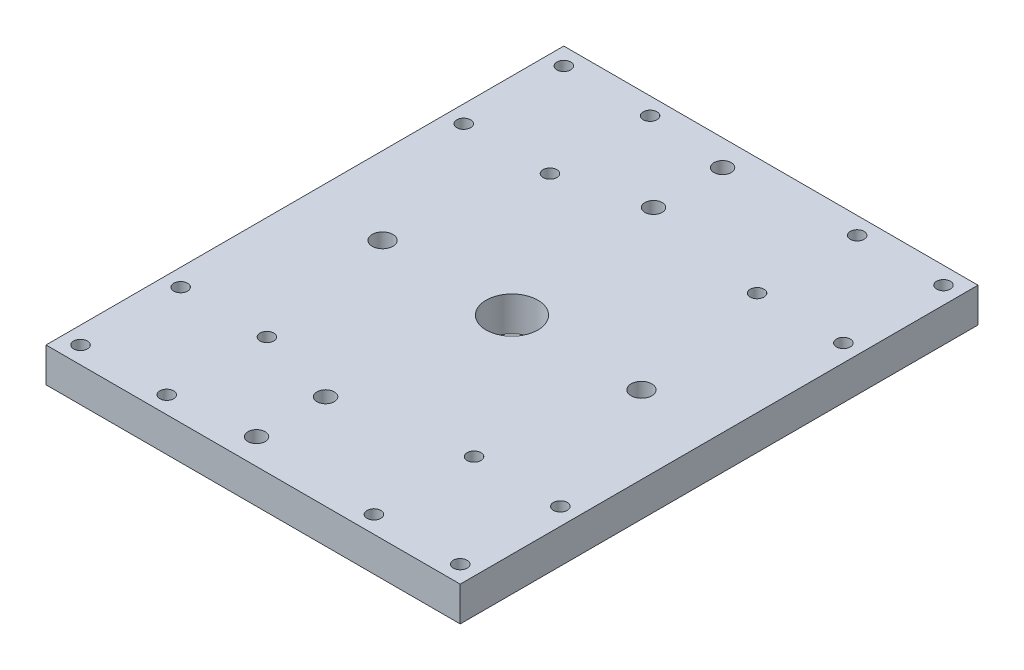
ISO-10303-21;
HEADER;
FILE_DESCRIPTION(('STEP AP214'),'2;1');
FILE_NAME('part.step','',(''),(''),'','','');
FILE_SCHEMA(('AUTOMOTIVE_DESIGN { 1 0 10303 214 1 1 1 1 }'));
ENDSEC;
DATA;
#1=APPLICATION_CONTEXT('core data for automotive mechanical design processes');
#2=APPLICATION_PROTOCOL_DEFINITION('international standard','automotive_design',2000,#1);
#3=PRODUCT_CONTEXT('',#1,'mechanical');
#4=PRODUCT('Part','Part','',(#3));
#5=PRODUCT_RELATED_PRODUCT_CATEGORY('part','',(#4));
#6=PRODUCT_DEFINITION_FORMATION('','',#4);
#7=PRODUCT_DEFINITION_CONTEXT('part definition',#1,'design');
#8=PRODUCT_DEFINITION('design','',#6,#7);
#9=PRODUCT_DEFINITION_SHAPE('','',#8);
#10=(LENGTH_UNIT() NAMED_UNIT(*) SI_UNIT(.MILLI.,.METRE.));
#11=(NAMED_UNIT(*) PLANE_ANGLE_UNIT() SI_UNIT($,.RADIAN.));
#12=(NAMED_UNIT(*) SI_UNIT($,.STERADIAN.) SOLID_ANGLE_UNIT());
#13=UNCERTAINTY_MEASURE_WITH_UNIT(LENGTH_MEASURE(1.E-05),#10,'distance_accuracy_value','');
#14=(GEOMETRIC_REPRESENTATION_CONTEXT(3) GLOBAL_UNCERTAINTY_ASSIGNED_CONTEXT((#13)) GLOBAL_UNIT_ASSIGNED_CONTEXT((#10,
#11,#12)) REPRESENTATION_CONTEXT('',''));
#15=CARTESIAN_POINT('',(0.,0.,0.));
#16=DIRECTION('',(0.,0.,1.));
#17=DIRECTION('',(1.,0.,0.));
#18=AXIS2_PLACEMENT_3D('',#15,#16,#17);
#19=CARTESIAN_POINT('',(0.,0.,0.));
#20=DIRECTION('',(0.,-1.,0.));
#21=DIRECTION('',(0.,0.,-1.));
#22=AXIS2_PLACEMENT_3D('',#19,#20,#21);
#23=PLANE('',#22);
#24=CARTESIAN_POINT('',(-75.,0.,0.));
#25=DIRECTION('',(0.,1.,0.));
#26=DIRECTION('',(0.,0.,1.));
#27=AXIS2_PLACEMENT_3D('',#24,#25,#26);
#28=CIRCLE('',#27,6.);
#29=CARTESIAN_POINT('',(-75.,0.,6.));
#30=VERTEX_POINT('',#29);
#31=EDGE_CURVE('E168',#30,#30,#28,.T.);
#32=ORIENTED_EDGE('',*,*,#31,.T.);
#33=EDGE_LOOP('',(#32));
#34=FACE_BOUND('',#33,.T.);
#35=CARTESIAN_POINT('',(-13.,0.,95.));
#36=DIRECTION('',(0.,1.,0.));
#37=DIRECTION('',(0.,0.,1.));
#38=AXIS2_PLACEMENT_3D('',#35,#36,#37);
#39=CIRCLE('',#38,5.);
#40=CARTESIAN_POINT('',(-13.,0.,100.));
#41=VERTEX_POINT('',#40);
#42=EDGE_CURVE('E182',#41,#41,#39,.T.);
#43=ORIENTED_EDGE('',*,*,#42,.T.);
#44=EDGE_LOOP('',(#43));
#45=FACE_BOUND('',#44,.T.);
#46=CARTESIAN_POINT('',(-13.,0.,-135.));
#47=DIRECTION('',(0.,1.,0.));
#48=DIRECTION('',(0.,0.,1.));
#49=AXIS2_PLACEMENT_3D('',#46,#47,#48);
#50=CIRCLE('',#49,5.);
#51=CARTESIAN_POINT('',(-13.,0.,-130.));
#52=VERTEX_POINT('',#51);
#53=EDGE_CURVE('E192',#52,#52,#50,.T.);
#54=ORIENTED_EDGE('',*,*,#53,.T.);
#55=EDGE_LOOP('',(#54));
#56=FACE_BOUND('',#55,.T.);
#57=CARTESIAN_POINT('',(-13.,0.,-95.));
#58=DIRECTION('',(0.,1.,0.));
#59=DIRECTION('',(0.,0.,1.));
#60=AXIS2_PLACEMENT_3D('',#57,#58,#59);
#61=CIRCLE('',#60,5.);
#62=CARTESIAN_POINT('',(-13.,0.,-90.));
#63=VERTEX_POINT('',#62);
#64=EDGE_CURVE('E198',#63,#63,#61,.T.);
#65=ORIENTED_EDGE('',*,*,#64,.T.);
#66=EDGE_LOOP('',(#65));
#67=FACE_BOUND('',#66,.T.);
#68=CARTESIAN_POINT('',(60.,0.,-82.));
#69=DIRECTION('',(0.,-1.,0.));
#70=DIRECTION('',(0.,0.,-1.));
#71=AXIS2_PLACEMENT_3D('',#68,#69,#70);
#72=CIRCLE('',#71,4.);
#73=CARTESIAN_POINT('',(60.,0.,-86.));
#74=VERTEX_POINT('',#73);
#75=EDGE_CURVE('E204',#74,#74,#72,.T.);
#76=ORIENTED_EDGE('',*,*,#75,.F.);
#77=EDGE_LOOP('',(#76));
#78=FACE_BOUND('',#77,.T.);
#79=CARTESIAN_POINT('',(110.,0.,-82.));
#80=DIRECTION('',(0.,-1.,0.));
#81=DIRECTION('',(0.,0.,-1.));
#82=AXIS2_PLACEMENT_3D('',#79,#80,#81);
#83=CIRCLE('',#82,4.);
#84=CARTESIAN_POINT('',(110.,0.,-86.));
#85=VERTEX_POINT('',#84);
#86=EDGE_CURVE('E210',#85,#85,#83,.T.);
#87=ORIENTED_EDGE('',*,*,#86,.F.);
#88=EDGE_LOOP('',(#87));
#89=FACE_BOUND('',#88,.T.);
#90=CARTESIAN_POINT('',(110.,0.,-140.));
#91=DIRECTION('',(0.,-1.,0.));
#92=DIRECTION('',(0.,0.,-1.));
#93=AXIS2_PLACEMENT_3D('',#90,#91,#92);
#94=CIRCLE('',#93,4.);
#95=CARTESIAN_POINT('',(110.,0.,-144.));
#96=VERTEX_POINT('',#95);
#97=EDGE_CURVE('E216',#96,#96,#94,.T.);
#98=ORIENTED_EDGE('',*,*,#97,.F.);
#99=EDGE_LOOP('',(#98));
#100=FACE_BOUND('',#99,.T.);
#101=CARTESIAN_POINT('',(60.,0.,-140.));
#102=DIRECTION('',(0.,-1.,0.));
#103=DIRECTION('',(0.,0.,-1.));
#104=AXIS2_PLACEMENT_3D('',#101,#102,#103);
#105=CIRCLE('',#104,4.);
#106=CARTESIAN_POINT('',(60.,0.,-144.));
#107=VERTEX_POINT('',#106);
#108=EDGE_CURVE('E222',#107,#107,#105,.T.);
#109=ORIENTED_EDGE('',*,*,#108,.F.);
#110=EDGE_LOOP('',(#109));
#111=FACE_BOUND('',#110,.T.);
#112=CARTESIAN_POINT('',(-110.,0.,-140.));
#113=DIRECTION('',(0.,-1.,0.));
#114=DIRECTION('',(0.,0.,-1.));
#115=AXIS2_PLACEMENT_3D('',#112,#113,#114);
#116=CIRCLE('',#115,4.);
#117=CARTESIAN_POINT('',(-110.,0.,-144.));
#118=VERTEX_POINT('',#117);
#119=EDGE_CURVE('E225',#118,#118,#116,.T.);
#120=ORIENTED_EDGE('',*,*,#119,.F.);
#121=EDGE_LOOP('',(#120));
#122=FACE_BOUND('',#121,.T.);
#123=CARTESIAN_POINT('',(-110.,0.,-82.));
#124=DIRECTION('',(0.,-1.,0.));
#125=DIRECTION('',(0.,0.,-1.));
#126=AXIS2_PLACEMENT_3D('',#123,#124,#125);
#127=CIRCLE('',#126,4.);
#128=CARTESIAN_POINT('',(-110.,0.,-86.));
#129=VERTEX_POINT('',#128);
#130=EDGE_CURVE('E231',#129,#129,#127,.T.);
#131=ORIENTED_EDGE('',*,*,#130,.F.);
#132=EDGE_LOOP('',(#131));
#133=FACE_BOUND('',#132,.T.);
#134=CARTESIAN_POINT('',(-60.,0.,-82.));
#135=DIRECTION('',(0.,-1.,0.));
#136=DIRECTION('',(0.,0.,-1.));
#137=AXIS2_PLACEMENT_3D('',#134,#135,#136);
#138=CIRCLE('',#137,4.);
#139=CARTESIAN_POINT('',(-60.,0.,-86.));
#140=VERTEX_POINT('',#139);
#141=EDGE_CURVE('E237',#140,#140,#138,.T.);
#142=ORIENTED_EDGE('',*,*,#141,.F.);
#143=EDGE_LOOP('',(#142));
#144=FACE_BOUND('',#143,.T.);
#145=CARTESIAN_POINT('',(-60.,0.,-140.));
#146=DIRECTION('',(0.,-1.,0.));
#147=DIRECTION('',(0.,0.,-1.));
#148=AXIS2_PLACEMENT_3D('',#145,#146,#147);
#149=CIRCLE('',#148,4.);
#150=CARTESIAN_POINT('',(-60.,0.,-144.));
#151=VERTEX_POINT('',#150);
#152=EDGE_CURVE('E243',#151,#151,#149,.T.);
#153=ORIENTED_EDGE('',*,*,#152,.F.);
#154=EDGE_LOOP('',(#153));
#155=FACE_BOUND('',#154,.T.);
#156=DIRECTION('',(0.,0.,-1.));
#157=VECTOR('',#156,1.);
#158=CARTESIAN_POINT('',(120.,0.,150.));
#159=LINE('',#158,#157);
#160=CARTESIAN_POINT('',(120.,0.,150.));
#161=VERTEX_POINT('',#160);
#162=CARTESIAN_POINT('',(120.,0.,-150.));
#163=VERTEX_POINT('',#162);
#164=EDGE_CURVE('E86',#161,#163,#159,.T.);
#165=ORIENTED_EDGE('',*,*,#164,.F.);
#166=DIRECTION('',(1.,0.,0.));
#167=VECTOR('',#166,1.);
#168=CARTESIAN_POINT('',(-120.,0.,150.));
#169=LINE('',#168,#167);
#170=CARTESIAN_POINT('',(-120.,0.,150.));
#171=VERTEX_POINT('',#170);
#172=EDGE_CURVE('E57',#171,#161,#169,.T.);
#173=ORIENTED_EDGE('',*,*,#172,.F.);
#174=DIRECTION('',(0.,0.,1.));
#175=VECTOR('',#174,1.);
#176=CARTESIAN_POINT('',(-120.,0.,150.));
#177=LINE('',#176,#175);
#178=CARTESIAN_POINT('',(-120.,0.,-150.));
#179=VERTEX_POINT('',#178);
#180=EDGE_CURVE('E51',#179,#171,#177,.T.);
#181=ORIENTED_EDGE('',*,*,#180,.F.);
#182=DIRECTION('',(-1.,0.,0.));
#183=VECTOR('',#182,1.);
#184=CARTESIAN_POINT('',(-120.,0.,-150.));
#185=LINE('',#184,#183);
#186=EDGE_CURVE('E76',#163,#179,#185,.T.);
#187=ORIENTED_EDGE('',*,*,#186,.F.);
#188=EDGE_LOOP('',(#165,#173,#181,#187));
#189=FACE_BOUND('',#188,.T.);
#190=CARTESIAN_POINT('',(-110.,0.,82.));
#191=DIRECTION('',(0.,-1.,0.));
#192=DIRECTION('',(0.,0.,-1.));
#193=AXIS2_PLACEMENT_3D('',#190,#191,#192);
#194=CIRCLE('',#193,4.);
#195=CARTESIAN_POINT('',(-110.,0.,78.));
#196=VERTEX_POINT('',#195);
#197=EDGE_CURVE('E99',#196,#196,#194,.T.);
#198=ORIENTED_EDGE('',*,*,#197,.F.);
#199=EDGE_LOOP('',(#198));
#200=FACE_BOUND('',#199,.T.);
#201=CARTESIAN_POINT('',(60.,0.,82.));
#202=DIRECTION('',(0.,-1.,0.));
#203=DIRECTION('',(0.,0.,-1.));
#204=AXIS2_PLACEMENT_3D('',#201,#202,#203);
#205=CIRCLE('',#204,4.);
#206=CARTESIAN_POINT('',(60.,0.,78.));
#207=VERTEX_POINT('',#206);
#208=EDGE_CURVE('E105',#207,#207,#205,.T.);
#209=ORIENTED_EDGE('',*,*,#208,.F.);
#210=EDGE_LOOP('',(#209));
#211=FACE_BOUND('',#210,.T.);
#212=CARTESIAN_POINT('',(-60.,0.,82.));
#213=DIRECTION('',(0.,-1.,0.));
#214=DIRECTION('',(0.,0.,-1.));
#215=AXIS2_PLACEMENT_3D('',#212,#213,#214);
#216=CIRCLE('',#215,4.);
#217=CARTESIAN_POINT('',(-60.,0.,78.));
#218=VERTEX_POINT('',#217);
#219=EDGE_CURVE('E111',#218,#218,#216,.T.);
#220=ORIENTED_EDGE('',*,*,#219,.F.);
#221=EDGE_LOOP('',(#220));
#222=FACE_BOUND('',#221,.T.);
#223=CARTESIAN_POINT('',(110.,0.,82.));
#224=DIRECTION('',(0.,-1.,0.));
#225=DIRECTION('',(0.,0.,-1.));
#226=AXIS2_PLACEMENT_3D('',#223,#224,#225);
#227=CIRCLE('',#226,4.);
#228=CARTESIAN_POINT('',(110.,0.,78.));
#229=VERTEX_POINT('',#228);
#230=EDGE_CURVE('E117',#229,#229,#227,.T.);
#231=ORIENTED_EDGE('',*,*,#230,.F.);
#232=EDGE_LOOP('',(#231));
#233=FACE_BOUND('',#232,.T.);
#234=CARTESIAN_POINT('',(-60.,0.,140.));
#235=DIRECTION('',(0.,-1.,0.));
#236=DIRECTION('',(0.,0.,-1.));
#237=AXIS2_PLACEMENT_3D('',#234,#235,#236);
#238=CIRCLE('',#237,4.);
#239=CARTESIAN_POINT('',(-60.,0.,136.));
#240=VERTEX_POINT('',#239);
#241=EDGE_CURVE('E123',#240,#240,#238,.T.);
#242=ORIENTED_EDGE('',*,*,#241,.F.);
#243=EDGE_LOOP('',(#242));
#244=FACE_BOUND('',#243,.T.);
#245=CARTESIAN_POINT('',(110.,0.,140.));
#246=DIRECTION('',(0.,-1.,0.));
#247=DIRECTION('',(0.,0.,-1.));
#248=AXIS2_PLACEMENT_3D('',#245,#246,#247);
#249=CIRCLE('',#248,4.);
#250=CARTESIAN_POINT('',(110.,0.,136.));
#251=VERTEX_POINT('',#250);
#252=EDGE_CURVE('E129',#251,#251,#249,.T.);
#253=ORIENTED_EDGE('',*,*,#252,.F.);
#254=EDGE_LOOP('',(#253));
#255=FACE_BOUND('',#254,.T.);
#256=CARTESIAN_POINT('',(-110.,0.,140.));
#257=DIRECTION('',(0.,-1.,0.));
#258=DIRECTION('',(0.,0.,-1.));
#259=AXIS2_PLACEMENT_3D('',#256,#257,#258);
#260=CIRCLE('',#259,4.);
#261=CARTESIAN_POINT('',(-110.,0.,136.));
#262=VERTEX_POINT('',#261);
#263=EDGE_CURVE('E135',#262,#262,#260,.T.);
#264=ORIENTED_EDGE('',*,*,#263,.F.);
#265=EDGE_LOOP('',(#264));
#266=FACE_BOUND('',#265,.T.);
#267=CARTESIAN_POINT('',(60.,0.,140.));
#268=DIRECTION('',(0.,-1.,0.));
#269=DIRECTION('',(0.,0.,-1.));
#270=AXIS2_PLACEMENT_3D('',#267,#268,#269);
#271=CIRCLE('',#270,4.);
#272=CARTESIAN_POINT('',(60.,0.,136.));
#273=VERTEX_POINT('',#272);
#274=EDGE_CURVE('E11',#273,#273,#271,.T.);
#275=ORIENTED_EDGE('',*,*,#274,.F.);
#276=EDGE_LOOP('',(#275));
#277=FACE_BOUND('',#276,.T.);
#278=CARTESIAN_POINT('',(-13.,0.,135.));
#279=DIRECTION('',(0.,1.,0.));
#280=DIRECTION('',(0.,0.,1.));
#281=AXIS2_PLACEMENT_3D('',#278,#279,#280);
#282=CIRCLE('',#281,5.);
#283=CARTESIAN_POINT('',(-13.,0.,140.));
#284=VERTEX_POINT('',#283);
#285=EDGE_CURVE('E155',#284,#284,#282,.T.);
#286=ORIENTED_EDGE('',*,*,#285,.T.);
#287=EDGE_LOOP('',(#286));
#288=FACE_BOUND('',#287,.T.);
#289=CARTESIAN_POINT('',(75.,0.,0.));
#290=DIRECTION('',(0.,1.,0.));
#291=DIRECTION('',(0.,0.,1.));
#292=AXIS2_PLACEMENT_3D('',#289,#290,#291);
#293=CIRCLE('',#292,6.);
#294=CARTESIAN_POINT('',(75.,0.,6.));
#295=VERTEX_POINT('',#294);
#296=EDGE_CURVE('E159',#295,#295,#293,.T.);
#297=ORIENTED_EDGE('',*,*,#296,.T.);
#298=EDGE_LOOP('',(#297));
#299=FACE_BOUND('',#298,.T.);
#300=CARTESIAN_POINT('',(0.,0.,0.));
#301=DIRECTION('',(0.,1.,0.));
#302=DIRECTION('',(0.,0.,1.));
#303=AXIS2_PLACEMENT_3D('',#300,#301,#302);
#304=CIRCLE('',#303,15.);
#305=CARTESIAN_POINT('',(0.,0.,15.));
#306=VERTEX_POINT('',#305);
#307=EDGE_CURVE('E162',#306,#306,#304,.T.);
#308=ORIENTED_EDGE('',*,*,#307,.T.);
#309=EDGE_LOOP('',(#308));
#310=FACE_BOUND('',#309,.T.);
#311=ADVANCED_FACE('F17',(#34,#45,#56,#67,#78,#89,#100,#111,#122,#133,#144,#155,#189,#200,#211,
#222,#233,#244,#255,#266,#277,#288,#299,#310),#23,.T.);
#312=CARTESIAN_POINT('',(0.,20.,0.));
#313=DIRECTION('',(0.,-1.,0.));
#314=DIRECTION('',(0.,0.,-1.));
#315=AXIS2_PLACEMENT_3D('',#312,#313,#314);
#316=PLANE('',#315);
#317=CARTESIAN_POINT('',(-75.,20.,0.));
#318=DIRECTION('',(0.,1.,0.));
#319=DIRECTION('',(0.,0.,1.));
#320=AXIS2_PLACEMENT_3D('',#317,#318,#319);
#321=CIRCLE('',#320,6.);
#322=CARTESIAN_POINT('',(-75.,20.,6.));
#323=VERTEX_POINT('',#322);
#324=EDGE_CURVE('E164',#323,#323,#321,.T.);
#325=ORIENTED_EDGE('',*,*,#324,.F.);
#326=EDGE_LOOP('',(#325));
#327=FACE_BOUND('',#326,.T.);
#328=CARTESIAN_POINT('',(-13.,20.,95.));
#329=DIRECTION('',(0.,1.,0.));
#330=DIRECTION('',(0.,0.,1.));
#331=AXIS2_PLACEMENT_3D('',#328,#329,#330);
#332=CIRCLE('',#331,5.);
#333=CARTESIAN_POINT('',(-13.,20.,100.));
#334=VERTEX_POINT('',#333);
#335=EDGE_CURVE('E179',#334,#334,#332,.T.);
#336=ORIENTED_EDGE('',*,*,#335,.F.);
#337=EDGE_LOOP('',(#336));
#338=FACE_BOUND('',#337,.T.);
#339=CARTESIAN_POINT('',(-13.,20.,-135.));
#340=DIRECTION('',(0.,1.,0.));
#341=DIRECTION('',(0.,0.,1.));
#342=AXIS2_PLACEMENT_3D('',#339,#340,#341);
#343=CIRCLE('',#342,5.);
#344=CARTESIAN_POINT('',(-13.,20.,-130.));
#345=VERTEX_POINT('',#344);
#346=EDGE_CURVE('E189',#345,#345,#343,.T.);
#347=ORIENTED_EDGE('',*,*,#346,.F.);
#348=EDGE_LOOP('',(#347));
#349=FACE_BOUND('',#348,.T.);
#350=CARTESIAN_POINT('',(-13.,20.,-95.));
#351=DIRECTION('',(0.,1.,0.));
#352=DIRECTION('',(0.,0.,1.));
#353=AXIS2_PLACEMENT_3D('',#350,#351,#352);
#354=CIRCLE('',#353,5.);
#355=CARTESIAN_POINT('',(-13.,20.,-90.));
#356=VERTEX_POINT('',#355);
#357=EDGE_CURVE('E195',#356,#356,#354,.T.);
#358=ORIENTED_EDGE('',*,*,#357,.F.);
#359=EDGE_LOOP('',(#358));
#360=FACE_BOUND('',#359,.T.);
#361=CARTESIAN_POINT('',(60.,20.,-82.));
#362=DIRECTION('',(0.,-1.,0.));
#363=DIRECTION('',(0.,0.,-1.));
#364=AXIS2_PLACEMENT_3D('',#361,#362,#363);
#365=CIRCLE('',#364,4.);
#366=CARTESIAN_POINT('',(60.,20.,-86.));
#367=VERTEX_POINT('',#366);
#368=EDGE_CURVE('E201',#367,#367,#365,.T.);
#369=ORIENTED_EDGE('',*,*,#368,.T.);
#370=EDGE_LOOP('',(#369));
#371=FACE_BOUND('',#370,.T.);
#372=CARTESIAN_POINT('',(110.,20.,-82.));
#373=DIRECTION('',(0.,-1.,0.));
#374=DIRECTION('',(0.,0.,-1.));
#375=AXIS2_PLACEMENT_3D('',#372,#373,#374);
#376=CIRCLE('',#375,4.);
#377=CARTESIAN_POINT('',(110.,20.,-86.));
#378=VERTEX_POINT('',#377);
#379=EDGE_CURVE('E207',#378,#378,#376,.T.);
#380=ORIENTED_EDGE('',*,*,#379,.T.);
#381=EDGE_LOOP('',(#380));
#382=FACE_BOUND('',#381,.T.);
#383=CARTESIAN_POINT('',(110.,20.,-140.));
#384=DIRECTION('',(0.,-1.,0.));
#385=DIRECTION('',(0.,0.,-1.));
#386=AXIS2_PLACEMENT_3D('',#383,#384,#385);
#387=CIRCLE('',#386,4.);
#388=CARTESIAN_POINT('',(110.,20.,-144.));
#389=VERTEX_POINT('',#388);
#390=EDGE_CURVE('E213',#389,#389,#387,.T.);
#391=ORIENTED_EDGE('',*,*,#390,.T.);
#392=EDGE_LOOP('',(#391));
#393=FACE_BOUND('',#392,.T.);
#394=CARTESIAN_POINT('',(60.,20.,-140.));
#395=DIRECTION('',(0.,-1.,0.));
#396=DIRECTION('',(0.,0.,-1.));
#397=AXIS2_PLACEMENT_3D('',#394,#395,#396);
#398=CIRCLE('',#397,4.);
#399=CARTESIAN_POINT('',(60.,20.,-144.));
#400=VERTEX_POINT('',#399);
#401=EDGE_CURVE('E219',#400,#400,#398,.T.);
#402=ORIENTED_EDGE('',*,*,#401,.T.);
#403=EDGE_LOOP('',(#402));
#404=FACE_BOUND('',#403,.T.);
#405=CARTESIAN_POINT('',(-110.,20.,-140.));
#406=DIRECTION('',(0.,-1.,0.));
#407=DIRECTION('',(0.,0.,-1.));
#408=AXIS2_PLACEMENT_3D('',#405,#406,#407);
#409=CIRCLE('',#408,4.);
#410=CARTESIAN_POINT('',(-110.,20.,-144.));
#411=VERTEX_POINT('',#410);
#412=EDGE_CURVE('E228',#411,#411,#409,.T.);
#413=ORIENTED_EDGE('',*,*,#412,.T.);
#414=EDGE_LOOP('',(#413));
#415=FACE_BOUND('',#414,.T.);
#416=CARTESIAN_POINT('',(-110.,20.,-82.));
#417=DIRECTION('',(0.,-1.,0.));
#418=DIRECTION('',(0.,0.,-1.));
#419=AXIS2_PLACEMENT_3D('',#416,#417,#418);
#420=CIRCLE('',#419,4.);
#421=CARTESIAN_POINT('',(-110.,20.,-86.));
#422=VERTEX_POINT('',#421);
#423=EDGE_CURVE('E234',#422,#422,#420,.T.);
#424=ORIENTED_EDGE('',*,*,#423,.T.);
#425=EDGE_LOOP('',(#424));
#426=FACE_BOUND('',#425,.T.);
#427=CARTESIAN_POINT('',(-60.,20.,-82.));
#428=DIRECTION('',(0.,-1.,0.));
#429=DIRECTION('',(0.,0.,-1.));
#430=AXIS2_PLACEMENT_3D('',#427,#428,#429);
#431=CIRCLE('',#430,4.);
#432=CARTESIAN_POINT('',(-60.,20.,-86.));
#433=VERTEX_POINT('',#432);
#434=EDGE_CURVE('E240',#433,#433,#431,.T.);
#435=ORIENTED_EDGE('',*,*,#434,.T.);
#436=EDGE_LOOP('',(#435));
#437=FACE_BOUND('',#436,.T.);
#438=CARTESIAN_POINT('',(-60.,20.,-140.));
#439=DIRECTION('',(0.,-1.,0.));
#440=DIRECTION('',(0.,0.,-1.));
#441=AXIS2_PLACEMENT_3D('',#438,#439,#440);
#442=CIRCLE('',#441,4.);
#443=CARTESIAN_POINT('',(-60.,20.,-144.));
#444=VERTEX_POINT('',#443);
#445=EDGE_CURVE('E89',#444,#444,#442,.T.);
#446=ORIENTED_EDGE('',*,*,#445,.T.);
#447=EDGE_LOOP('',(#446));
#448=FACE_BOUND('',#447,.T.);
#449=DIRECTION('',(0.,0.,-1.));
#450=VECTOR('',#449,1.);
#451=CARTESIAN_POINT('',(120.,20.,150.));
#452=LINE('',#451,#450);
#453=CARTESIAN_POINT('',(120.,20.,150.));
#454=VERTEX_POINT('',#453);
#455=CARTESIAN_POINT('',(120.,20.,-150.));
#456=VERTEX_POINT('',#455);
#457=EDGE_CURVE('E71',#454,#456,#452,.T.);
#458=ORIENTED_EDGE('',*,*,#457,.T.);
#459=DIRECTION('',(-1.,0.,0.));
#460=VECTOR('',#459,1.);
#461=CARTESIAN_POINT('',(-120.,20.,-150.));
#462=LINE('',#461,#460);
#463=CARTESIAN_POINT('',(-120.,20.,-150.));
#464=VERTEX_POINT('',#463);
#465=EDGE_CURVE('E65',#456,#464,#462,.T.);
#466=ORIENTED_EDGE('',*,*,#465,.T.);
#467=DIRECTION('',(0.,0.,1.));
#468=VECTOR('',#467,1.);
#469=CARTESIAN_POINT('',(-120.,20.,150.));
#470=LINE('',#469,#468);
#471=CARTESIAN_POINT('',(-120.,20.,150.));
#472=VERTEX_POINT('',#471);
#473=EDGE_CURVE('E69',#464,#472,#470,.T.);
#474=ORIENTED_EDGE('',*,*,#473,.T.);
#475=DIRECTION('',(1.,0.,0.));
#476=VECTOR('',#475,1.);
#477=CARTESIAN_POINT('',(-120.,20.,150.));
#478=LINE('',#477,#476);
#479=EDGE_CURVE('E34',#472,#454,#478,.T.);
#480=ORIENTED_EDGE('',*,*,#479,.T.);
#481=EDGE_LOOP('',(#458,#466,#474,#480));
#482=FACE_BOUND('',#481,.T.);
#483=CARTESIAN_POINT('',(-110.,20.,82.));
#484=DIRECTION('',(0.,-1.,0.));
#485=DIRECTION('',(0.,0.,-1.));
#486=AXIS2_PLACEMENT_3D('',#483,#484,#485);
#487=CIRCLE('',#486,4.);
#488=CARTESIAN_POINT('',(-110.,20.,78.));
#489=VERTEX_POINT('',#488);
#490=EDGE_CURVE('E96',#489,#489,#487,.T.);
#491=ORIENTED_EDGE('',*,*,#490,.T.);
#492=EDGE_LOOP('',(#491));
#493=FACE_BOUND('',#492,.T.);
#494=CARTESIAN_POINT('',(60.,20.,82.));
#495=DIRECTION('',(0.,-1.,0.));
#496=DIRECTION('',(0.,0.,-1.));
#497=AXIS2_PLACEMENT_3D('',#494,#495,#496);
#498=CIRCLE('',#497,4.);
#499=CARTESIAN_POINT('',(60.,20.,78.));
#500=VERTEX_POINT('',#499);
#501=EDGE_CURVE('E102',#500,#500,#498,.T.);
#502=ORIENTED_EDGE('',*,*,#501,.T.);
#503=EDGE_LOOP('',(#502));
#504=FACE_BOUND('',#503,.T.);
#505=CARTESIAN_POINT('',(-60.,20.,82.));
#506=DIRECTION('',(0.,-1.,0.));
#507=DIRECTION('',(0.,0.,-1.));
#508=AXIS2_PLACEMENT_3D('',#505,#506,#507);
#509=CIRCLE('',#508,4.);
#510=CARTESIAN_POINT('',(-60.,20.,78.));
#511=VERTEX_POINT('',#510);
#512=EDGE_CURVE('E108',#511,#511,#509,.T.);
#513=ORIENTED_EDGE('',*,*,#512,.T.);
#514=EDGE_LOOP('',(#513));
#515=FACE_BOUND('',#514,.T.);
#516=CARTESIAN_POINT('',(110.,20.,82.));
#517=DIRECTION('',(0.,-1.,0.));
#518=DIRECTION('',(0.,0.,-1.));
#519=AXIS2_PLACEMENT_3D('',#516,#517,#518);
#520=CIRCLE('',#519,4.);
#521=CARTESIAN_POINT('',(110.,20.,78.));
#522=VERTEX_POINT('',#521);
#523=EDGE_CURVE('E114',#522,#522,#520,.T.);
#524=ORIENTED_EDGE('',*,*,#523,.T.);
#525=EDGE_LOOP('',(#524));
#526=FACE_BOUND('',#525,.T.);
#527=CARTESIAN_POINT('',(-60.,20.,140.));
#528=DIRECTION('',(0.,-1.,0.));
#529=DIRECTION('',(0.,0.,-1.));
#530=AXIS2_PLACEMENT_3D('',#527,#528,#529);
#531=CIRCLE('',#530,4.);
#532=CARTESIAN_POINT('',(-60.,20.,136.));
#533=VERTEX_POINT('',#532);
#534=EDGE_CURVE('E120',#533,#533,#531,.T.);
#535=ORIENTED_EDGE('',*,*,#534,.T.);
#536=EDGE_LOOP('',(#535));
#537=FACE_BOUND('',#536,.T.);
#538=CARTESIAN_POINT('',(110.,20.,140.));
#539=DIRECTION('',(0.,-1.,0.));
#540=DIRECTION('',(0.,0.,-1.));
#541=AXIS2_PLACEMENT_3D('',#538,#539,#540);
#542=CIRCLE('',#541,4.);
#543=CARTESIAN_POINT('',(110.,20.,136.));
#544=VERTEX_POINT('',#543);
#545=EDGE_CURVE('E126',#544,#544,#542,.T.);
#546=ORIENTED_EDGE('',*,*,#545,.T.);
#547=EDGE_LOOP('',(#546));
#548=FACE_BOUND('',#547,.T.);
#549=CARTESIAN_POINT('',(-110.,20.,140.));
#550=DIRECTION('',(0.,-1.,0.));
#551=DIRECTION('',(0.,0.,-1.));
#552=AXIS2_PLACEMENT_3D('',#549,#550,#551);
#553=CIRCLE('',#552,4.);
#554=CARTESIAN_POINT('',(-110.,20.,136.));
#555=VERTEX_POINT('',#554);
#556=EDGE_CURVE('E132',#555,#555,#553,.T.);
#557=ORIENTED_EDGE('',*,*,#556,.T.);
#558=EDGE_LOOP('',(#557));
#559=FACE_BOUND('',#558,.T.);
#560=CARTESIAN_POINT('',(60.,20.,140.));
#561=DIRECTION('',(0.,-1.,0.));
#562=DIRECTION('',(0.,0.,-1.));
#563=AXIS2_PLACEMENT_3D('',#560,#561,#562);
#564=CIRCLE('',#563,4.);
#565=CARTESIAN_POINT('',(60.,20.,136.));
#566=VERTEX_POINT('',#565);
#567=EDGE_CURVE('E26',#566,#566,#564,.T.);
#568=ORIENTED_EDGE('',*,*,#567,.T.);
#569=EDGE_LOOP('',(#568));
#570=FACE_BOUND('',#569,.T.);
#571=CARTESIAN_POINT('',(-13.,20.,135.));
#572=DIRECTION('',(0.,1.,0.));
#573=DIRECTION('',(0.,0.,1.));
#574=AXIS2_PLACEMENT_3D('',#571,#572,#573);
#575=CIRCLE('',#574,5.);
#576=CARTESIAN_POINT('',(-13.,20.,140.));
#577=VERTEX_POINT('',#576);
#578=EDGE_CURVE('E185',#577,#577,#575,.T.);
#579=ORIENTED_EDGE('',*,*,#578,.F.);
#580=EDGE_LOOP('',(#579));
#581=FACE_BOUND('',#580,.T.);
#582=CARTESIAN_POINT('',(75.,20.,0.));
#583=DIRECTION('',(0.,1.,0.));
#584=DIRECTION('',(0.,0.,1.));
#585=AXIS2_PLACEMENT_3D('',#582,#583,#584);
#586=CIRCLE('',#585,6.);
#587=CARTESIAN_POINT('',(75.,20.,6.));
#588=VERTEX_POINT('',#587);
#589=EDGE_CURVE('E175',#588,#588,#586,.T.);
#590=ORIENTED_EDGE('',*,*,#589,.F.);
#591=EDGE_LOOP('',(#590));
#592=FACE_BOUND('',#591,.T.);
#593=CARTESIAN_POINT('',(0.,20.,0.));
#594=DIRECTION('',(0.,1.,0.));
#595=DIRECTION('',(0.,0.,1.));
#596=AXIS2_PLACEMENT_3D('',#593,#594,#595);
#597=CIRCLE('',#596,15.);
#598=CARTESIAN_POINT('',(0.,20.,15.));
#599=VERTEX_POINT('',#598);
#600=EDGE_CURVE('E165',#599,#599,#597,.T.);
#601=ORIENTED_EDGE('',*,*,#600,.F.);
#602=EDGE_LOOP('',(#601));
#603=FACE_BOUND('',#602,.T.);
#604=ADVANCED_FACE('F66',(#327,#338,#349,#360,#371,#382,#393,#404,#415,#426,#437,#448,#482,#493,
#504,#515,#526,#537,#548,#559,#570,#581,#592,#603),#316,.F.);
#605=CARTESIAN_POINT('',(120.,20.,150.));
#606=DIRECTION('',(-1.,0.,0.));
#607=DIRECTION('',(0.,0.,1.));
#608=AXIS2_PLACEMENT_3D('',#605,#606,#607);
#609=PLANE('',#608);
#610=ORIENTED_EDGE('',*,*,#164,.T.);
#611=DIRECTION('',(0.,-1.,0.));
#612=VECTOR('',#611,1.);
#613=CARTESIAN_POINT('',(120.,20.,-150.));
#614=LINE('',#613,#612);
#615=EDGE_CURVE('E77',#456,#163,#614,.T.);
#616=ORIENTED_EDGE('',*,*,#615,.F.);
#617=ORIENTED_EDGE('',*,*,#457,.F.);
#618=DIRECTION('',(0.,-1.,0.));
#619=VECTOR('',#618,1.);
#620=CARTESIAN_POINT('',(120.,20.,150.));
#621=LINE('',#620,#619);
#622=EDGE_CURVE('E82',#454,#161,#621,.T.);
#623=ORIENTED_EDGE('',*,*,#622,.T.);
#624=EDGE_LOOP('',(#610,#616,#617,#623));
#625=FACE_BOUND('',#624,.T.);
#626=ADVANCED_FACE('F314',(#625),#609,.F.);
#627=CARTESIAN_POINT('',(-120.,20.,-150.));
#628=DIRECTION('',(0.,0.,1.));
#629=DIRECTION('',(1.,0.,0.));
#630=AXIS2_PLACEMENT_3D('',#627,#628,#629);
#631=PLANE('',#630);
#632=ORIENTED_EDGE('',*,*,#186,.T.);
#633=DIRECTION('',(0.,-1.,0.));
#634=VECTOR('',#633,1.);
#635=CARTESIAN_POINT('',(-120.,20.,-150.));
#636=LINE('',#635,#634);
#637=EDGE_CURVE('E74',#464,#179,#636,.T.);
#638=ORIENTED_EDGE('',*,*,#637,.F.);
#639=ORIENTED_EDGE('',*,*,#465,.F.);
#640=ORIENTED_EDGE('',*,*,#615,.T.);
#641=EDGE_LOOP('',(#632,#638,#639,#640));
#642=FACE_BOUND('',#641,.T.);
#643=ADVANCED_FACE('F75',(#642),#631,.F.);
#644=CARTESIAN_POINT('',(-120.,20.,150.));
#645=DIRECTION('',(1.,0.,0.));
#646=DIRECTION('',(0.,0.,-1.));
#647=AXIS2_PLACEMENT_3D('',#644,#645,#646);
#648=PLANE('',#647);
#649=ORIENTED_EDGE('',*,*,#180,.T.);
#650=DIRECTION('',(0.,-1.,0.));
#651=VECTOR('',#650,1.);
#652=CARTESIAN_POINT('',(-120.,20.,150.));
#653=LINE('',#652,#651);
#654=EDGE_CURVE('E78',#472,#171,#653,.T.);
#655=ORIENTED_EDGE('',*,*,#654,.F.);
#656=ORIENTED_EDGE('',*,*,#473,.F.);
#657=ORIENTED_EDGE('',*,*,#637,.T.);
#658=EDGE_LOOP('',(#649,#655,#656,#657));
#659=FACE_BOUND('',#658,.T.);
#660=ADVANCED_FACE('F80',(#659),#648,.F.);
#661=CARTESIAN_POINT('',(-120.,20.,150.));
#662=DIRECTION('',(0.,0.,-1.));
#663=DIRECTION('',(-1.,0.,0.));
#664=AXIS2_PLACEMENT_3D('',#661,#662,#663);
#665=PLANE('',#664);
#666=ORIENTED_EDGE('',*,*,#172,.T.);
#667=ORIENTED_EDGE('',*,*,#622,.F.);
#668=ORIENTED_EDGE('',*,*,#479,.F.);
#669=ORIENTED_EDGE('',*,*,#654,.T.);
#670=EDGE_LOOP('',(#666,#667,#668,#669));
#671=FACE_BOUND('',#670,.T.);
#672=ADVANCED_FACE('F254',(#671),#665,.F.);
#673=CARTESIAN_POINT('',(-60.,0.,-140.));
#674=DIRECTION('',(0.,-1.,0.));
#675=DIRECTION('',(0.,0.,-1.));
#676=AXIS2_PLACEMENT_3D('',#673,#674,#675);
#677=CYLINDRICAL_SURFACE('',#676,4.);
#678=ORIENTED_EDGE('',*,*,#445,.F.);
#679=EDGE_LOOP('',(#678));
#680=FACE_BOUND('',#679,.T.);
#681=ORIENTED_EDGE('',*,*,#152,.T.);
#682=EDGE_LOOP('',(#681));
#683=FACE_BOUND('',#682,.T.);
#684=ADVANCED_FACE('F250',(#680,#683),#677,.F.);
#685=CARTESIAN_POINT('',(-60.,0.,-82.));
#686=DIRECTION('',(0.,-1.,0.));
#687=DIRECTION('',(0.,0.,-1.));
#688=AXIS2_PLACEMENT_3D('',#685,#686,#687);
#689=CYLINDRICAL_SURFACE('',#688,4.);
#690=ORIENTED_EDGE('',*,*,#434,.F.);
#691=EDGE_LOOP('',(#690));
#692=FACE_BOUND('',#691,.T.);
#693=ORIENTED_EDGE('',*,*,#141,.T.);
#694=EDGE_LOOP('',(#693));
#695=FACE_BOUND('',#694,.T.);
#696=ADVANCED_FACE('F253',(#692,#695),#689,.F.);
#697=CARTESIAN_POINT('',(-110.,0.,-82.));
#698=DIRECTION('',(0.,-1.,0.));
#699=DIRECTION('',(0.,0.,-1.));
#700=AXIS2_PLACEMENT_3D('',#697,#698,#699);
#701=CYLINDRICAL_SURFACE('',#700,4.);
#702=ORIENTED_EDGE('',*,*,#423,.F.);
#703=EDGE_LOOP('',(#702));
#704=FACE_BOUND('',#703,.T.);
#705=ORIENTED_EDGE('',*,*,#130,.T.);
#706=EDGE_LOOP('',(#705));
#707=FACE_BOUND('',#706,.T.);
#708=ADVANCED_FACE('F329',(#704,#707),#701,.F.);
#709=CARTESIAN_POINT('',(-110.,0.,-140.));
#710=DIRECTION('',(0.,-1.,0.));
#711=DIRECTION('',(0.,0.,-1.));
#712=AXIS2_PLACEMENT_3D('',#709,#710,#711);
#713=CYLINDRICAL_SURFACE('',#712,4.);
#714=ORIENTED_EDGE('',*,*,#412,.F.);
#715=EDGE_LOOP('',(#714));
#716=FACE_BOUND('',#715,.T.);
#717=ORIENTED_EDGE('',*,*,#119,.T.);
#718=EDGE_LOOP('',(#717));
#719=FACE_BOUND('',#718,.T.);
#720=ADVANCED_FACE('F333',(#716,#719),#713,.F.);
#721=CARTESIAN_POINT('',(60.,0.,-140.));
#722=DIRECTION('',(0.,-1.,0.));
#723=DIRECTION('',(0.,0.,-1.));
#724=AXIS2_PLACEMENT_3D('',#721,#722,#723);
#725=CYLINDRICAL_SURFACE('',#724,4.);
#726=ORIENTED_EDGE('',*,*,#401,.F.);
#727=EDGE_LOOP('',(#726));
#728=FACE_BOUND('',#727,.T.);
#729=ORIENTED_EDGE('',*,*,#108,.T.);
#730=EDGE_LOOP('',(#729));
#731=FACE_BOUND('',#730,.T.);
#732=ADVANCED_FACE('F312',(#728,#731),#725,.F.);
#733=CARTESIAN_POINT('',(-110.,0.,82.));
#734=DIRECTION('',(0.,-1.,0.));
#735=DIRECTION('',(0.,0.,-1.));
#736=AXIS2_PLACEMENT_3D('',#733,#734,#735);
#737=CYLINDRICAL_SURFACE('',#736,4.);
#738=ORIENTED_EDGE('',*,*,#490,.F.);
#739=EDGE_LOOP('',(#738));
#740=FACE_BOUND('',#739,.T.);
#741=ORIENTED_EDGE('',*,*,#197,.T.);
#742=EDGE_LOOP('',(#741));
#743=FACE_BOUND('',#742,.T.);
#744=ADVANCED_FACE('F308',(#740,#743),#737,.F.);
#745=CARTESIAN_POINT('',(60.,0.,82.));
#746=DIRECTION('',(0.,-1.,0.));
#747=DIRECTION('',(0.,0.,-1.));
#748=AXIS2_PLACEMENT_3D('',#745,#746,#747);
#749=CYLINDRICAL_SURFACE('',#748,4.);
#750=ORIENTED_EDGE('',*,*,#501,.F.);
#751=EDGE_LOOP('',(#750));
#752=FACE_BOUND('',#751,.T.);
#753=ORIENTED_EDGE('',*,*,#208,.T.);
#754=EDGE_LOOP('',(#753));
#755=FACE_BOUND('',#754,.T.);
#756=ADVANCED_FACE('F305',(#752,#755),#749,.F.);
#757=CARTESIAN_POINT('',(110.,0.,-140.));
#758=DIRECTION('',(0.,-1.,0.));
#759=DIRECTION('',(0.,0.,-1.));
#760=AXIS2_PLACEMENT_3D('',#757,#758,#759);
#761=CYLINDRICAL_SURFACE('',#760,4.);
#762=ORIENTED_EDGE('',*,*,#390,.F.);
#763=EDGE_LOOP('',(#762));
#764=FACE_BOUND('',#763,.T.);
#765=ORIENTED_EDGE('',*,*,#97,.T.);
#766=EDGE_LOOP('',(#765));
#767=FACE_BOUND('',#766,.T.);
#768=ADVANCED_FACE('F303',(#764,#767),#761,.F.);
#769=CARTESIAN_POINT('',(-60.,0.,82.));
#770=DIRECTION('',(0.,-1.,0.));
#771=DIRECTION('',(0.,0.,-1.));
#772=AXIS2_PLACEMENT_3D('',#769,#770,#771);
#773=CYLINDRICAL_SURFACE('',#772,4.);
#774=ORIENTED_EDGE('',*,*,#512,.F.);
#775=EDGE_LOOP('',(#774));
#776=FACE_BOUND('',#775,.T.);
#777=ORIENTED_EDGE('',*,*,#219,.T.);
#778=EDGE_LOOP('',(#777));
#779=FACE_BOUND('',#778,.T.);
#780=ADVANCED_FACE('F299',(#776,#779),#773,.F.);
#781=CARTESIAN_POINT('',(110.,0.,82.));
#782=DIRECTION('',(0.,-1.,0.));
#783=DIRECTION('',(0.,0.,-1.));
#784=AXIS2_PLACEMENT_3D('',#781,#782,#783);
#785=CYLINDRICAL_SURFACE('',#784,4.);
#786=ORIENTED_EDGE('',*,*,#523,.F.);
#787=EDGE_LOOP('',(#786));
#788=FACE_BOUND('',#787,.T.);
#789=ORIENTED_EDGE('',*,*,#230,.T.);
#790=EDGE_LOOP('',(#789));
#791=FACE_BOUND('',#790,.T.);
#792=ADVANCED_FACE('F296',(#788,#791),#785,.F.);
#793=CARTESIAN_POINT('',(110.,0.,-82.));
#794=DIRECTION('',(0.,-1.,0.));
#795=DIRECTION('',(0.,0.,-1.));
#796=AXIS2_PLACEMENT_3D('',#793,#794,#795);
#797=CYLINDRICAL_SURFACE('',#796,4.);
#798=ORIENTED_EDGE('',*,*,#379,.F.);
#799=EDGE_LOOP('',(#798));
#800=FACE_BOUND('',#799,.T.);
#801=ORIENTED_EDGE('',*,*,#86,.T.);
#802=EDGE_LOOP('',(#801));
#803=FACE_BOUND('',#802,.T.);
#804=ADVANCED_FACE('F294',(#800,#803),#797,.F.);
#805=CARTESIAN_POINT('',(-60.,0.,140.));
#806=DIRECTION('',(0.,-1.,0.));
#807=DIRECTION('',(0.,0.,-1.));
#808=AXIS2_PLACEMENT_3D('',#805,#806,#807);
#809=CYLINDRICAL_SURFACE('',#808,4.);
#810=ORIENTED_EDGE('',*,*,#534,.F.);
#811=EDGE_LOOP('',(#810));
#812=FACE_BOUND('',#811,.T.);
#813=ORIENTED_EDGE('',*,*,#241,.T.);
#814=EDGE_LOOP('',(#813));
#815=FACE_BOUND('',#814,.T.);
#816=ADVANCED_FACE('F290',(#812,#815),#809,.F.);
#817=CARTESIAN_POINT('',(110.,0.,140.));
#818=DIRECTION('',(0.,-1.,0.));
#819=DIRECTION('',(0.,0.,-1.));
#820=AXIS2_PLACEMENT_3D('',#817,#818,#819);
#821=CYLINDRICAL_SURFACE('',#820,4.);
#822=ORIENTED_EDGE('',*,*,#545,.F.);
#823=EDGE_LOOP('',(#822));
#824=FACE_BOUND('',#823,.T.);
#825=ORIENTED_EDGE('',*,*,#252,.T.);
#826=EDGE_LOOP('',(#825));
#827=FACE_BOUND('',#826,.T.);
#828=ADVANCED_FACE('F283',(#824,#827),#821,.F.);
#829=CARTESIAN_POINT('',(60.,0.,-82.));
#830=DIRECTION('',(0.,-1.,0.));
#831=DIRECTION('',(0.,0.,-1.));
#832=AXIS2_PLACEMENT_3D('',#829,#830,#831);
#833=CYLINDRICAL_SURFACE('',#832,4.);
#834=ORIENTED_EDGE('',*,*,#368,.F.);
#835=EDGE_LOOP('',(#834));
#836=FACE_BOUND('',#835,.T.);
#837=ORIENTED_EDGE('',*,*,#75,.T.);
#838=EDGE_LOOP('',(#837));
#839=FACE_BOUND('',#838,.T.);
#840=ADVANCED_FACE('F276',(#836,#839),#833,.F.);
#841=CARTESIAN_POINT('',(-110.,0.,140.));
#842=DIRECTION('',(0.,-1.,0.));
#843=DIRECTION('',(0.,0.,-1.));
#844=AXIS2_PLACEMENT_3D('',#841,#842,#843);
#845=CYLINDRICAL_SURFACE('',#844,4.);
#846=ORIENTED_EDGE('',*,*,#556,.F.);
#847=EDGE_LOOP('',(#846));
#848=FACE_BOUND('',#847,.T.);
#849=ORIENTED_EDGE('',*,*,#263,.T.);
#850=EDGE_LOOP('',(#849));
#851=FACE_BOUND('',#850,.T.);
#852=ADVANCED_FACE('F145',(#848,#851),#845,.F.);
#853=CARTESIAN_POINT('',(60.,0.,140.));
#854=DIRECTION('',(0.,-1.,0.));
#855=DIRECTION('',(0.,0.,-1.));
#856=AXIS2_PLACEMENT_3D('',#853,#854,#855);
#857=CYLINDRICAL_SURFACE('',#856,4.);
#858=ORIENTED_EDGE('',*,*,#567,.F.);
#859=EDGE_LOOP('',(#858));
#860=FACE_BOUND('',#859,.T.);
#861=ORIENTED_EDGE('',*,*,#274,.T.);
#862=EDGE_LOOP('',(#861));
#863=FACE_BOUND('',#862,.T.);
#864=ADVANCED_FACE('F19',(#860,#863),#857,.F.);
#865=CARTESIAN_POINT('',(-13.,20.,-95.));
#866=DIRECTION('',(0.,1.,0.));
#867=DIRECTION('',(0.,0.,1.));
#868=AXIS2_PLACEMENT_3D('',#865,#866,#867);
#869=CYLINDRICAL_SURFACE('',#868,5.);
#870=ORIENTED_EDGE('',*,*,#64,.F.);
#871=EDGE_LOOP('',(#870));
#872=FACE_BOUND('',#871,.T.);
#873=ORIENTED_EDGE('',*,*,#357,.T.);
#874=EDGE_LOOP('',(#873));
#875=FACE_BOUND('',#874,.T.);
#876=ADVANCED_FACE('F144',(#872,#875),#869,.F.);
#877=CARTESIAN_POINT('',(-13.,20.,-135.));
#878=DIRECTION('',(0.,1.,0.));
#879=DIRECTION('',(0.,0.,1.));
#880=AXIS2_PLACEMENT_3D('',#877,#878,#879);
#881=CYLINDRICAL_SURFACE('',#880,5.);
#882=ORIENTED_EDGE('',*,*,#53,.F.);
#883=EDGE_LOOP('',(#882));
#884=FACE_BOUND('',#883,.T.);
#885=ORIENTED_EDGE('',*,*,#346,.T.);
#886=EDGE_LOOP('',(#885));
#887=FACE_BOUND('',#886,.T.);
#888=ADVANCED_FACE('F349',(#884,#887),#881,.F.);
#889=CARTESIAN_POINT('',(-13.,20.,135.));
#890=DIRECTION('',(0.,1.,0.));
#891=DIRECTION('',(0.,0.,1.));
#892=AXIS2_PLACEMENT_3D('',#889,#890,#891);
#893=CYLINDRICAL_SURFACE('',#892,5.);
#894=ORIENTED_EDGE('',*,*,#285,.F.);
#895=EDGE_LOOP('',(#894));
#896=FACE_BOUND('',#895,.T.);
#897=ORIENTED_EDGE('',*,*,#578,.T.);
#898=EDGE_LOOP('',(#897));
#899=FACE_BOUND('',#898,.T.);
#900=ADVANCED_FACE('F353',(#896,#899),#893,.F.);
#901=CARTESIAN_POINT('',(-13.,20.,95.));
#902=DIRECTION('',(0.,1.,0.));
#903=DIRECTION('',(0.,0.,1.));
#904=AXIS2_PLACEMENT_3D('',#901,#902,#903);
#905=CYLINDRICAL_SURFACE('',#904,5.);
#906=ORIENTED_EDGE('',*,*,#42,.F.);
#907=EDGE_LOOP('',(#906));
#908=FACE_BOUND('',#907,.T.);
#909=ORIENTED_EDGE('',*,*,#335,.T.);
#910=EDGE_LOOP('',(#909));
#911=FACE_BOUND('',#910,.T.);
#912=ADVANCED_FACE('F357',(#908,#911),#905,.F.);
#913=CARTESIAN_POINT('',(75.,20.,0.));
#914=DIRECTION('',(0.,1.,0.));
#915=DIRECTION('',(0.,0.,1.));
#916=AXIS2_PLACEMENT_3D('',#913,#914,#915);
#917=CYLINDRICAL_SURFACE('',#916,6.);
#918=ORIENTED_EDGE('',*,*,#296,.F.);
#919=EDGE_LOOP('',(#918));
#920=FACE_BOUND('',#919,.T.);
#921=ORIENTED_EDGE('',*,*,#589,.T.);
#922=EDGE_LOOP('',(#921));
#923=FACE_BOUND('',#922,.T.);
#924=ADVANCED_FACE('F361',(#920,#923),#917,.F.);
#925=CARTESIAN_POINT('',(-75.,20.,0.));
#926=DIRECTION('',(0.,1.,0.));
#927=DIRECTION('',(0.,0.,1.));
#928=AXIS2_PLACEMENT_3D('',#925,#926,#927);
#929=CYLINDRICAL_SURFACE('',#928,6.);
#930=ORIENTED_EDGE('',*,*,#31,.F.);
#931=EDGE_LOOP('',(#930));
#932=FACE_BOUND('',#931,.T.);
#933=ORIENTED_EDGE('',*,*,#324,.T.);
#934=EDGE_LOOP('',(#933));
#935=FACE_BOUND('',#934,.T.);
#936=ADVANCED_FACE('F365',(#932,#935),#929,.F.);
#937=CARTESIAN_POINT('',(0.,20.,0.));
#938=DIRECTION('',(0.,1.,0.));
#939=DIRECTION('',(0.,0.,1.));
#940=AXIS2_PLACEMENT_3D('',#937,#938,#939);
#941=CYLINDRICAL_SURFACE('',#940,15.);
#942=ORIENTED_EDGE('',*,*,#307,.F.);
#943=EDGE_LOOP('',(#942));
#944=FACE_BOUND('',#943,.T.);
#945=ORIENTED_EDGE('',*,*,#600,.T.);
#946=EDGE_LOOP('',(#945));
#947=FACE_BOUND('',#946,.T.);
#948=ADVANCED_FACE('F369',(#944,#947),#941,.F.);
#949=CLOSED_SHELL('',(#311,#604,#626,#643,#660,#672,#684,#696,#708,#720,#732,#744,#756,#768,
#780,#792,#804,#816,#828,#840,#852,#864,#876,#888,#900,#912,#924,#936,#948));
#950=MANIFOLD_SOLID_BREP('B1',#949);
#951=ADVANCED_BREP_SHAPE_REPRESENTATION('',(#18,#950),#14);
#952=SHAPE_DEFINITION_REPRESENTATION(#9,#951);
ENDSEC;
END-ISO-10303-21;
